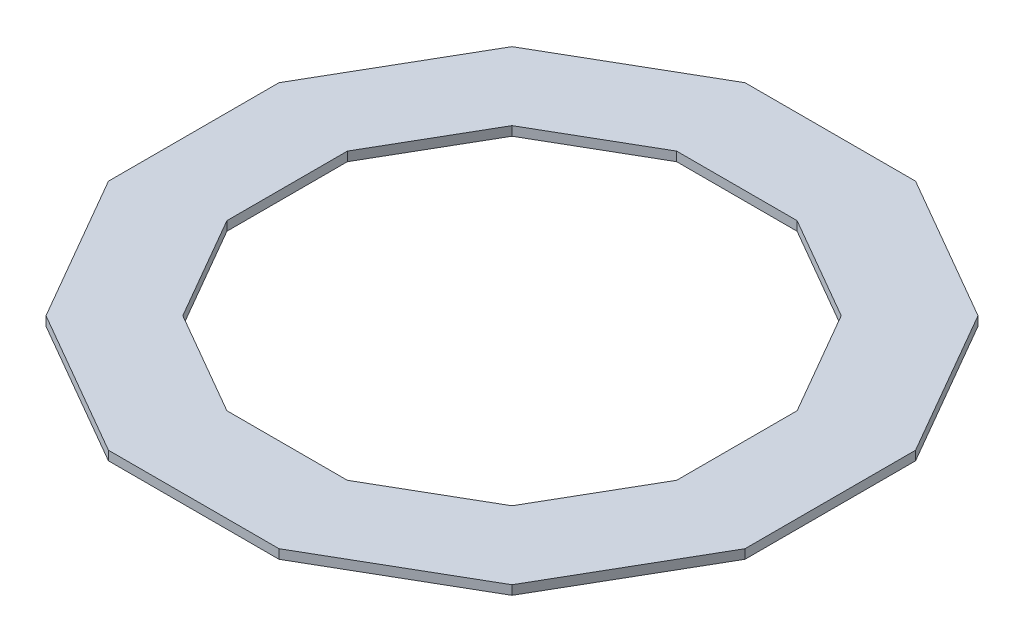
ISO-10303-21;
HEADER;
FILE_DESCRIPTION(('STEP AP214'),'2;1');
FILE_NAME('part.step','',(''),(''),'','','');
FILE_SCHEMA(('AUTOMOTIVE_DESIGN { 1 0 10303 214 1 1 1 1 }'));
ENDSEC;
DATA;
#1=APPLICATION_CONTEXT('core data for automotive mechanical design processes');
#2=APPLICATION_PROTOCOL_DEFINITION('international standard','automotive_design',2000,#1);
#3=PRODUCT_CONTEXT('',#1,'mechanical');
#4=PRODUCT('Part','Part','',(#3));
#5=PRODUCT_RELATED_PRODUCT_CATEGORY('part','',(#4));
#6=PRODUCT_DEFINITION_FORMATION('','',#4);
#7=PRODUCT_DEFINITION_CONTEXT('part definition',#1,'design');
#8=PRODUCT_DEFINITION('design','',#6,#7);
#9=PRODUCT_DEFINITION_SHAPE('','',#8);
#10=(LENGTH_UNIT() NAMED_UNIT(*) SI_UNIT(.MILLI.,.METRE.));
#11=(NAMED_UNIT(*) PLANE_ANGLE_UNIT() SI_UNIT($,.RADIAN.));
#12=(NAMED_UNIT(*) SI_UNIT($,.STERADIAN.) SOLID_ANGLE_UNIT());
#13=UNCERTAINTY_MEASURE_WITH_UNIT(LENGTH_MEASURE(1.E-05),#10,'distance_accuracy_value','');
#14=(GEOMETRIC_REPRESENTATION_CONTEXT(3) GLOBAL_UNCERTAINTY_ASSIGNED_CONTEXT((#13)) GLOBAL_UNIT_ASSIGNED_CONTEXT((#10,
#11,#12)) REPRESENTATION_CONTEXT('',''));
#15=CARTESIAN_POINT('',(0.,0.,0.));
#16=DIRECTION('',(0.,0.,1.));
#17=DIRECTION('',(1.,0.,0.));
#18=AXIS2_PLACEMENT_3D('',#15,#16,#17);
#19=CARTESIAN_POINT('',(0.,-2.921,0.));
#20=DIRECTION('',(0.,1.,0.));
#21=DIRECTION('',(0.,0.,1.));
#22=AXIS2_PLACEMENT_3D('',#19,#20,#21);
#23=PLANE('',#22);
#24=DIRECTION('',(0.5,0.,-0.866025403784439));
#25=VECTOR('',#24,1.);
#26=CARTESIAN_POINT('',(-61.8302660744763,-2.921,-35.6977207621651));
#27=LINE('',#26,#25);
#28=CARTESIAN_POINT('',(-71.3954415243302,-2.921,-19.1303508997077));
#29=VERTEX_POINT('',#28);
#30=CARTESIAN_POINT('',(-52.2650906246225,-2.921,-52.2650906246225));
#31=VERTEX_POINT('',#30);
#32=EDGE_CURVE('E278',#29,#31,#27,.T.);
#33=ORIENTED_EDGE('',*,*,#32,.F.);
#34=DIRECTION('',(0.,0.,-1.));
#35=VECTOR('',#34,1.);
#36=CARTESIAN_POINT('',(-71.3954415243302,-2.921,0.));
#37=LINE('',#36,#35);
#38=CARTESIAN_POINT('',(-71.3954415243302,-2.921,19.1303508997077));
#39=VERTEX_POINT('',#38);
#40=EDGE_CURVE('E280',#39,#29,#37,.T.);
#41=ORIENTED_EDGE('',*,*,#40,.F.);
#42=DIRECTION('',(-0.5,0.,-0.866025403784439));
#43=VECTOR('',#42,1.);
#44=CARTESIAN_POINT('',(-61.8302660744764,-2.921,35.6977207621651));
#45=LINE('',#44,#43);
#46=CARTESIAN_POINT('',(-52.2650906246225,-2.921,52.2650906246225));
#47=VERTEX_POINT('',#46);
#48=EDGE_CURVE('E283',#47,#39,#45,.T.);
#49=ORIENTED_EDGE('',*,*,#48,.F.);
#50=DIRECTION('',(-0.866025403784439,0.,-0.5));
#51=VECTOR('',#50,1.);
#52=CARTESIAN_POINT('',(-35.6977207621651,-2.921,61.8302660744764));
#53=LINE('',#52,#51);
#54=CARTESIAN_POINT('',(-19.1303508997077,-2.921,71.3954415243302));
#55=VERTEX_POINT('',#54);
#56=EDGE_CURVE('E285',#55,#47,#53,.T.);
#57=ORIENTED_EDGE('',*,*,#56,.F.);
#58=DIRECTION('',(-1.,0.,0.));
#59=VECTOR('',#58,1.);
#60=CARTESIAN_POINT('',(0.,-2.921,71.3954415243302));
#61=LINE('',#60,#59);
#62=CARTESIAN_POINT('',(19.1303508997077,-2.921,71.3954415243302));
#63=VERTEX_POINT('',#62);
#64=EDGE_CURVE('E287',#63,#55,#61,.T.);
#65=ORIENTED_EDGE('',*,*,#64,.F.);
#66=DIRECTION('',(-0.866025403784439,0.,0.5));
#67=VECTOR('',#66,1.);
#68=CARTESIAN_POINT('',(35.6977207621651,-2.921,61.8302660744764));
#69=LINE('',#68,#67);
#70=CARTESIAN_POINT('',(52.2650906246225,-2.921,52.2650906246225));
#71=VERTEX_POINT('',#70);
#72=EDGE_CURVE('E289',#71,#63,#69,.T.);
#73=ORIENTED_EDGE('',*,*,#72,.F.);
#74=DIRECTION('',(-0.5,0.,0.866025403784439));
#75=VECTOR('',#74,1.);
#76=CARTESIAN_POINT('',(61.8302660744764,-2.921,35.6977207621651));
#77=LINE('',#76,#75);
#78=CARTESIAN_POINT('',(71.3954415243302,-2.921,19.1303508997077));
#79=VERTEX_POINT('',#78);
#80=EDGE_CURVE('E291',#79,#71,#77,.T.);
#81=ORIENTED_EDGE('',*,*,#80,.F.);
#82=DIRECTION('',(0.,0.,1.));
#83=VECTOR('',#82,1.);
#84=CARTESIAN_POINT('',(71.3954415243302,-2.921,0.));
#85=LINE('',#84,#83);
#86=CARTESIAN_POINT('',(71.3954415243302,-2.921,-19.1303508997077));
#87=VERTEX_POINT('',#86);
#88=EDGE_CURVE('E293',#87,#79,#85,.T.);
#89=ORIENTED_EDGE('',*,*,#88,.F.);
#90=DIRECTION('',(0.5,0.,0.866025403784439));
#91=VECTOR('',#90,1.);
#92=CARTESIAN_POINT('',(61.8302660744763,-2.921,-35.6977207621651));
#93=LINE('',#92,#91);
#94=CARTESIAN_POINT('',(52.2650906246225,-2.921,-52.2650906246225));
#95=VERTEX_POINT('',#94);
#96=EDGE_CURVE('E295',#95,#87,#93,.T.);
#97=ORIENTED_EDGE('',*,*,#96,.F.);
#98=DIRECTION('',(0.866025403784439,0.,0.5));
#99=VECTOR('',#98,1.);
#100=CARTESIAN_POINT('',(35.6977207621651,-2.921,-61.8302660744763));
#101=LINE('',#100,#99);
#102=CARTESIAN_POINT('',(19.1303508997077,-2.921,-71.3954415243302));
#103=VERTEX_POINT('',#102);
#104=EDGE_CURVE('E297',#103,#95,#101,.T.);
#105=ORIENTED_EDGE('',*,*,#104,.F.);
#106=DIRECTION('',(1.,0.,0.));
#107=VECTOR('',#106,1.);
#108=CARTESIAN_POINT('',(0.,-2.921,-71.3954415243302));
#109=LINE('',#108,#107);
#110=CARTESIAN_POINT('',(-19.1303508997077,-2.921,-71.3954415243302));
#111=VERTEX_POINT('',#110);
#112=EDGE_CURVE('E299',#111,#103,#109,.T.);
#113=ORIENTED_EDGE('',*,*,#112,.F.);
#114=DIRECTION('',(0.866025403784439,0.,-0.5));
#115=VECTOR('',#114,1.);
#116=CARTESIAN_POINT('',(-35.6977207621651,-2.921,-61.8302660744763));
#117=LINE('',#116,#115);
#118=EDGE_CURVE('E301',#31,#111,#117,.T.);
#119=ORIENTED_EDGE('',*,*,#118,.F.);
#120=EDGE_LOOP('',(#33,#41,#49,#57,#65,#73,#81,#89,#97,#105,#113,#119));
#121=FACE_BOUND('',#120,.T.);
#122=DIRECTION('',(0.,0.,1.));
#123=VECTOR('',#122,1.);
#124=CARTESIAN_POINT('',(101.059063950969,-2.92100000000001,27.0786945735074));
#125=LINE('',#124,#123);
#126=CARTESIAN_POINT('',(101.059063950969,-2.92100000000001,-27.0786945735074));
#127=VERTEX_POINT('',#126);
#128=CARTESIAN_POINT('',(101.059063950969,-2.92100000000001,27.0786945735074));
#129=VERTEX_POINT('',#128);
#130=EDGE_CURVE('E210',#127,#129,#125,.T.);
#131=ORIENTED_EDGE('',*,*,#130,.T.);
#132=DIRECTION('',(-0.5,0.,0.866025403784439));
#133=VECTOR('',#132,1.);
#134=CARTESIAN_POINT('',(73.9803693774619,-2.92100000000001,73.9803693774619));
#135=LINE('',#134,#133);
#136=CARTESIAN_POINT('',(73.9803693774619,-2.92100000000001,73.9803693774619));
#137=VERTEX_POINT('',#136);
#138=EDGE_CURVE('E597',#129,#137,#135,.T.);
#139=ORIENTED_EDGE('',*,*,#138,.T.);
#140=DIRECTION('',(-0.866025403784439,0.,0.5));
#141=VECTOR('',#140,1.);
#142=CARTESIAN_POINT('',(27.0786945735074,-2.92100000000001,101.059063950969));
#143=LINE('',#142,#141);
#144=CARTESIAN_POINT('',(27.0786945735074,-2.92100000000001,101.059063950969));
#145=VERTEX_POINT('',#144);
#146=EDGE_CURVE('E599',#137,#145,#143,.T.);
#147=ORIENTED_EDGE('',*,*,#146,.T.);
#148=DIRECTION('',(-1.,0.,0.));
#149=VECTOR('',#148,1.);
#150=CARTESIAN_POINT('',(-27.0786945735074,-2.92100000000001,101.059063950969));
#151=LINE('',#150,#149);
#152=CARTESIAN_POINT('',(-27.0786945735074,-2.92100000000001,101.059063950969));
#153=VERTEX_POINT('',#152);
#154=EDGE_CURVE('E600',#145,#153,#151,.T.);
#155=ORIENTED_EDGE('',*,*,#154,.T.);
#156=DIRECTION('',(-0.866025403784439,0.,-0.5));
#157=VECTOR('',#156,1.);
#158=CARTESIAN_POINT('',(-73.9803693774619,-2.92100000000001,73.9803693774619));
#159=LINE('',#158,#157);
#160=CARTESIAN_POINT('',(-73.9803693774619,-2.92100000000001,73.9803693774619));
#161=VERTEX_POINT('',#160);
#162=EDGE_CURVE('E604',#153,#161,#159,.T.);
#163=ORIENTED_EDGE('',*,*,#162,.T.);
#164=DIRECTION('',(-0.5,0.,-0.866025403784438));
#165=VECTOR('',#164,1.);
#166=CARTESIAN_POINT('',(-101.059063950969,-2.92100000000001,27.0786945735074));
#167=LINE('',#166,#165);
#168=CARTESIAN_POINT('',(-101.059063950969,-2.92100000000001,27.0786945735074));
#169=VERTEX_POINT('',#168);
#170=EDGE_CURVE('E606',#161,#169,#167,.T.);
#171=ORIENTED_EDGE('',*,*,#170,.T.);
#172=DIRECTION('',(0.,0.,-1.));
#173=VECTOR('',#172,1.);
#174=CARTESIAN_POINT('',(-101.059063950969,-2.92100000000001,-27.0786945735074));
#175=LINE('',#174,#173);
#176=CARTESIAN_POINT('',(-101.059063950969,-2.92100000000001,-27.0786945735074));
#177=VERTEX_POINT('',#176);
#178=EDGE_CURVE('E608',#169,#177,#175,.T.);
#179=ORIENTED_EDGE('',*,*,#178,.T.);
#180=DIRECTION('',(0.500000000000001,0.,-0.866025403784438));
#181=VECTOR('',#180,1.);
#182=CARTESIAN_POINT('',(-73.9803693774619,-2.92100000000001,-73.9803693774619));
#183=LINE('',#182,#181);
#184=CARTESIAN_POINT('',(-73.9803693774619,-2.92100000000001,-73.9803693774619));
#185=VERTEX_POINT('',#184);
#186=EDGE_CURVE('E610',#177,#185,#183,.T.);
#187=ORIENTED_EDGE('',*,*,#186,.T.);
#188=DIRECTION('',(0.866025403784438,0.,-0.5));
#189=VECTOR('',#188,1.);
#190=CARTESIAN_POINT('',(-27.0786945735074,-2.92100000000001,-101.059063950969));
#191=LINE('',#190,#189);
#192=CARTESIAN_POINT('',(-27.0786945735074,-2.92100000000001,-101.059063950969));
#193=VERTEX_POINT('',#192);
#194=EDGE_CURVE('E612',#185,#193,#191,.T.);
#195=ORIENTED_EDGE('',*,*,#194,.T.);
#196=DIRECTION('',(1.,0.,0.));
#197=VECTOR('',#196,1.);
#198=CARTESIAN_POINT('',(27.0786945735074,-2.92100000000001,-101.059063950969));
#199=LINE('',#198,#197);
#200=CARTESIAN_POINT('',(27.0786945735074,-2.92100000000001,-101.059063950969));
#201=VERTEX_POINT('',#200);
#202=EDGE_CURVE('E614',#193,#201,#199,.T.);
#203=ORIENTED_EDGE('',*,*,#202,.T.);
#204=DIRECTION('',(0.866025403784438,0.,0.5));
#205=VECTOR('',#204,1.);
#206=CARTESIAN_POINT('',(73.9803693774619,-2.92100000000001,-73.9803693774619));
#207=LINE('',#206,#205);
#208=CARTESIAN_POINT('',(73.9803693774619,-2.92100000000001,-73.9803693774619));
#209=VERTEX_POINT('',#208);
#210=EDGE_CURVE('E258',#201,#209,#207,.T.);
#211=ORIENTED_EDGE('',*,*,#210,.T.);
#212=DIRECTION('',(0.5,0.,0.866025403784438));
#213=VECTOR('',#212,1.);
#214=CARTESIAN_POINT('',(101.059063950969,-2.92100000000001,-27.0786945735074));
#215=LINE('',#214,#213);
#216=EDGE_CURVE('E305',#209,#127,#215,.T.);
#217=ORIENTED_EDGE('',*,*,#216,.T.);
#218=EDGE_LOOP('',(#131,#139,#147,#155,#163,#171,#179,#187,#195,#203,#211,#217));
#219=FACE_BOUND('',#218,.T.);
#220=ADVANCED_FACE('F38',(#121,#219),#23,.F.);
#221=CARTESIAN_POINT('',(0.,0.,0.));
#222=DIRECTION('',(0.,1.,0.));
#223=DIRECTION('',(0.,0.,1.));
#224=AXIS2_PLACEMENT_3D('',#221,#222,#223);
#225=PLANE('',#224);
#226=DIRECTION('',(0.,0.,-1.));
#227=VECTOR('',#226,1.);
#228=CARTESIAN_POINT('',(-71.3954415243302,0.,0.));
#229=LINE('',#228,#227);
#230=CARTESIAN_POINT('',(-71.3954415243302,0.,19.1303508997077));
#231=VERTEX_POINT('',#230);
#232=CARTESIAN_POINT('',(-71.3954415243302,0.,-19.1303508997077));
#233=VERTEX_POINT('',#232);
#234=EDGE_CURVE('E304',#231,#233,#229,.T.);
#235=ORIENTED_EDGE('',*,*,#234,.T.);
#236=DIRECTION('',(0.5,0.,-0.866025403784439));
#237=VECTOR('',#236,1.);
#238=CARTESIAN_POINT('',(-61.8302660744763,0.,-35.6977207621651));
#239=LINE('',#238,#237);
#240=CARTESIAN_POINT('',(-52.2650906246225,0.,-52.2650906246225));
#241=VERTEX_POINT('',#240);
#242=EDGE_CURVE('E62',#233,#241,#239,.T.);
#243=ORIENTED_EDGE('',*,*,#242,.T.);
#244=DIRECTION('',(0.866025403784439,0.,-0.5));
#245=VECTOR('',#244,1.);
#246=CARTESIAN_POINT('',(-35.6977207621651,0.,-61.8302660744763));
#247=LINE('',#246,#245);
#248=CARTESIAN_POINT('',(-19.1303508997077,0.,-71.3954415243302));
#249=VERTEX_POINT('',#248);
#250=EDGE_CURVE('E281',#241,#249,#247,.T.);
#251=ORIENTED_EDGE('',*,*,#250,.T.);
#252=DIRECTION('',(1.,0.,0.));
#253=VECTOR('',#252,1.);
#254=CARTESIAN_POINT('',(0.,0.,-71.3954415243302));
#255=LINE('',#254,#253);
#256=CARTESIAN_POINT('',(19.1303508997077,0.,-71.3954415243302));
#257=VERTEX_POINT('',#256);
#258=EDGE_CURVE('E332',#249,#257,#255,.T.);
#259=ORIENTED_EDGE('',*,*,#258,.T.);
#260=DIRECTION('',(0.866025403784439,0.,0.5));
#261=VECTOR('',#260,1.);
#262=CARTESIAN_POINT('',(35.6977207621651,0.,-61.8302660744763));
#263=LINE('',#262,#261);
#264=CARTESIAN_POINT('',(52.2650906246225,0.,-52.2650906246225));
#265=VERTEX_POINT('',#264);
#266=EDGE_CURVE('E329',#257,#265,#263,.T.);
#267=ORIENTED_EDGE('',*,*,#266,.T.);
#268=DIRECTION('',(0.5,0.,0.866025403784439));
#269=VECTOR('',#268,1.);
#270=CARTESIAN_POINT('',(61.8302660744763,0.,-35.6977207621651));
#271=LINE('',#270,#269);
#272=CARTESIAN_POINT('',(71.3954415243302,0.,-19.1303508997077));
#273=VERTEX_POINT('',#272);
#274=EDGE_CURVE('E326',#265,#273,#271,.T.);
#275=ORIENTED_EDGE('',*,*,#274,.T.);
#276=DIRECTION('',(0.,0.,1.));
#277=VECTOR('',#276,1.);
#278=CARTESIAN_POINT('',(71.3954415243302,0.,0.));
#279=LINE('',#278,#277);
#280=CARTESIAN_POINT('',(71.3954415243302,0.,19.1303508997077));
#281=VERTEX_POINT('',#280);
#282=EDGE_CURVE('E323',#273,#281,#279,.T.);
#283=ORIENTED_EDGE('',*,*,#282,.T.);
#284=DIRECTION('',(-0.5,0.,0.866025403784439));
#285=VECTOR('',#284,1.);
#286=CARTESIAN_POINT('',(61.8302660744764,0.,35.6977207621651));
#287=LINE('',#286,#285);
#288=CARTESIAN_POINT('',(52.2650906246225,0.,52.2650906246225));
#289=VERTEX_POINT('',#288);
#290=EDGE_CURVE('E320',#281,#289,#287,.T.);
#291=ORIENTED_EDGE('',*,*,#290,.T.);
#292=DIRECTION('',(-0.866025403784439,0.,0.5));
#293=VECTOR('',#292,1.);
#294=CARTESIAN_POINT('',(35.6977207621651,0.,61.8302660744764));
#295=LINE('',#294,#293);
#296=CARTESIAN_POINT('',(19.1303508997077,0.,71.3954415243302));
#297=VERTEX_POINT('',#296);
#298=EDGE_CURVE('E317',#289,#297,#295,.T.);
#299=ORIENTED_EDGE('',*,*,#298,.T.);
#300=DIRECTION('',(-1.,0.,0.));
#301=VECTOR('',#300,1.);
#302=CARTESIAN_POINT('',(0.,0.,71.3954415243302));
#303=LINE('',#302,#301);
#304=CARTESIAN_POINT('',(-19.1303508997077,0.,71.3954415243302));
#305=VERTEX_POINT('',#304);
#306=EDGE_CURVE('E314',#297,#305,#303,.T.);
#307=ORIENTED_EDGE('',*,*,#306,.T.);
#308=DIRECTION('',(-0.866025403784439,0.,-0.5));
#309=VECTOR('',#308,1.);
#310=CARTESIAN_POINT('',(-35.6977207621651,0.,61.8302660744764));
#311=LINE('',#310,#309);
#312=CARTESIAN_POINT('',(-52.2650906246225,0.,52.2650906246225));
#313=VERTEX_POINT('',#312);
#314=EDGE_CURVE('E311',#305,#313,#311,.T.);
#315=ORIENTED_EDGE('',*,*,#314,.T.);
#316=DIRECTION('',(-0.5,0.,-0.866025403784439));
#317=VECTOR('',#316,1.);
#318=CARTESIAN_POINT('',(-61.8302660744764,0.,35.6977207621651));
#319=LINE('',#318,#317);
#320=EDGE_CURVE('E308',#313,#231,#319,.T.);
#321=ORIENTED_EDGE('',*,*,#320,.T.);
#322=EDGE_LOOP('',(#235,#243,#251,#259,#267,#275,#283,#291,#299,#307,#315,#321));
#323=FACE_BOUND('',#322,.T.);
#324=DIRECTION('',(0.,0.,-1.));
#325=VECTOR('',#324,1.);
#326=CARTESIAN_POINT('',(101.059063950969,0.,27.0786945735074));
#327=LINE('',#326,#325);
#328=CARTESIAN_POINT('',(101.059063950969,0.,27.0786945735074));
#329=VERTEX_POINT('',#328);
#330=CARTESIAN_POINT('',(101.059063950969,0.,-27.0786945735074));
#331=VERTEX_POINT('',#330);
#332=EDGE_CURVE('E208',#329,#331,#327,.T.);
#333=ORIENTED_EDGE('',*,*,#332,.T.);
#334=DIRECTION('',(-0.5,0.,-0.866025403784438));
#335=VECTOR('',#334,1.);
#336=CARTESIAN_POINT('',(101.059063950969,0.,-27.0786945735074));
#337=LINE('',#336,#335);
#338=CARTESIAN_POINT('',(73.9803693774619,0.,-73.9803693774619));
#339=VERTEX_POINT('',#338);
#340=EDGE_CURVE('E217',#331,#339,#337,.T.);
#341=ORIENTED_EDGE('',*,*,#340,.T.);
#342=DIRECTION('',(-0.866025403784438,0.,-0.5));
#343=VECTOR('',#342,1.);
#344=CARTESIAN_POINT('',(73.9803693774619,0.,-73.9803693774619));
#345=LINE('',#344,#343);
#346=CARTESIAN_POINT('',(27.0786945735074,0.,-101.059063950969));
#347=VERTEX_POINT('',#346);
#348=EDGE_CURVE('E223',#339,#347,#345,.T.);
#349=ORIENTED_EDGE('',*,*,#348,.T.);
#350=DIRECTION('',(-1.,0.,0.));
#351=VECTOR('',#350,1.);
#352=CARTESIAN_POINT('',(27.0786945735074,0.,-101.059063950969));
#353=LINE('',#352,#351);
#354=CARTESIAN_POINT('',(-27.0786945735074,0.,-101.059063950969));
#355=VERTEX_POINT('',#354);
#356=EDGE_CURVE('E232',#347,#355,#353,.T.);
#357=ORIENTED_EDGE('',*,*,#356,.T.);
#358=DIRECTION('',(-0.866025403784438,0.,0.5));
#359=VECTOR('',#358,1.);
#360=CARTESIAN_POINT('',(-27.0786945735074,0.,-101.059063950969));
#361=LINE('',#360,#359);
#362=CARTESIAN_POINT('',(-73.9803693774619,0.,-73.9803693774619));
#363=VERTEX_POINT('',#362);
#364=EDGE_CURVE('E235',#355,#363,#361,.T.);
#365=ORIENTED_EDGE('',*,*,#364,.T.);
#366=DIRECTION('',(-0.500000000000001,0.,0.866025403784438));
#367=VECTOR('',#366,1.);
#368=CARTESIAN_POINT('',(-73.9803693774619,0.,-73.9803693774619));
#369=LINE('',#368,#367);
#370=CARTESIAN_POINT('',(-101.059063950969,0.,-27.0786945735074));
#371=VERTEX_POINT('',#370);
#372=EDGE_CURVE('E238',#363,#371,#369,.T.);
#373=ORIENTED_EDGE('',*,*,#372,.T.);
#374=DIRECTION('',(0.,0.,1.));
#375=VECTOR('',#374,1.);
#376=CARTESIAN_POINT('',(-101.059063950969,0.,-27.0786945735074));
#377=LINE('',#376,#375);
#378=CARTESIAN_POINT('',(-101.059063950969,0.,27.0786945735074));
#379=VERTEX_POINT('',#378);
#380=EDGE_CURVE('E241',#371,#379,#377,.T.);
#381=ORIENTED_EDGE('',*,*,#380,.T.);
#382=DIRECTION('',(0.5,0.,0.866025403784438));
#383=VECTOR('',#382,1.);
#384=CARTESIAN_POINT('',(-101.059063950969,0.,27.0786945735074));
#385=LINE('',#384,#383);
#386=CARTESIAN_POINT('',(-73.9803693774619,0.,73.9803693774619));
#387=VERTEX_POINT('',#386);
#388=EDGE_CURVE('E244',#379,#387,#385,.T.);
#389=ORIENTED_EDGE('',*,*,#388,.T.);
#390=DIRECTION('',(0.866025403784438,0.,0.5));
#391=VECTOR('',#390,1.);
#392=CARTESIAN_POINT('',(-73.9803693774619,0.,73.9803693774619));
#393=LINE('',#392,#391);
#394=CARTESIAN_POINT('',(-27.0786945735074,0.,101.059063950969));
#395=VERTEX_POINT('',#394);
#396=EDGE_CURVE('E247',#387,#395,#393,.T.);
#397=ORIENTED_EDGE('',*,*,#396,.T.);
#398=DIRECTION('',(1.,0.,0.));
#399=VECTOR('',#398,1.);
#400=CARTESIAN_POINT('',(-27.0786945735074,0.,101.059063950969));
#401=LINE('',#400,#399);
#402=CARTESIAN_POINT('',(27.0786945735074,0.,101.059063950969));
#403=VERTEX_POINT('',#402);
#404=EDGE_CURVE('E250',#395,#403,#401,.T.);
#405=ORIENTED_EDGE('',*,*,#404,.T.);
#406=DIRECTION('',(0.866025403784439,0.,-0.5));
#407=VECTOR('',#406,1.);
#408=CARTESIAN_POINT('',(27.0786945735074,0.,101.059063950969));
#409=LINE('',#408,#407);
#410=CARTESIAN_POINT('',(73.9803693774619,0.,73.9803693774619));
#411=VERTEX_POINT('',#410);
#412=EDGE_CURVE('E253',#403,#411,#409,.T.);
#413=ORIENTED_EDGE('',*,*,#412,.T.);
#414=DIRECTION('',(0.5,0.,-0.866025403784439));
#415=VECTOR('',#414,1.);
#416=CARTESIAN_POINT('',(73.9803693774619,0.,73.9803693774619));
#417=LINE('',#416,#415);
#418=EDGE_CURVE('E214',#411,#329,#417,.T.);
#419=ORIENTED_EDGE('',*,*,#418,.T.);
#420=EDGE_LOOP('',(#333,#341,#349,#357,#365,#373,#381,#389,#397,#405,#413,#419));
#421=FACE_BOUND('',#420,.T.);
#422=ADVANCED_FACE('F40',(#323,#421),#225,.T.);
#423=CARTESIAN_POINT('',(-61.8302660744763,-2.921,-35.6977207621651));
#424=DIRECTION('',(0.866025403784439,0.,0.5));
#425=DIRECTION('',(0.5,0.,-0.866025403784439));
#426=AXIS2_PLACEMENT_3D('',#423,#424,#425);
#427=PLANE('',#426);
#428=ORIENTED_EDGE('',*,*,#242,.F.);
#429=DIRECTION('',(0.,1.,0.));
#430=VECTOR('',#429,1.);
#431=CARTESIAN_POINT('',(-71.3954415243302,-2.921,-19.1303508997077));
#432=LINE('',#431,#430);
#433=EDGE_CURVE('E42',#29,#233,#432,.T.);
#434=ORIENTED_EDGE('',*,*,#433,.F.);
#435=ORIENTED_EDGE('',*,*,#32,.T.);
#436=DIRECTION('',(0.,1.,0.));
#437=VECTOR('',#436,1.);
#438=CARTESIAN_POINT('',(-52.2650906246225,-2.921,-52.2650906246225));
#439=LINE('',#438,#437);
#440=EDGE_CURVE('E11',#31,#241,#439,.T.);
#441=ORIENTED_EDGE('',*,*,#440,.T.);
#442=EDGE_LOOP('',(#428,#434,#435,#441));
#443=FACE_BOUND('',#442,.T.);
#444=ADVANCED_FACE('F371',(#443),#427,.T.);
#445=CARTESIAN_POINT('',(-35.6977207621651,-2.921,-61.8302660744763));
#446=DIRECTION('',(0.5,0.,0.866025403784439));
#447=DIRECTION('',(0.866025403784439,0.,-0.5));
#448=AXIS2_PLACEMENT_3D('',#445,#446,#447);
#449=PLANE('',#448);
#450=ORIENTED_EDGE('',*,*,#250,.F.);
#451=ORIENTED_EDGE('',*,*,#440,.F.);
#452=ORIENTED_EDGE('',*,*,#118,.T.);
#453=DIRECTION('',(0.,1.,0.));
#454=VECTOR('',#453,1.);
#455=CARTESIAN_POINT('',(-19.1303508997077,-2.921,-71.3954415243302));
#456=LINE('',#455,#454);
#457=EDGE_CURVE('E47',#111,#249,#456,.T.);
#458=ORIENTED_EDGE('',*,*,#457,.T.);
#459=EDGE_LOOP('',(#450,#451,#452,#458));
#460=FACE_BOUND('',#459,.T.);
#461=ADVANCED_FACE('F373',(#460),#449,.T.);
#462=CARTESIAN_POINT('',(0.,-2.921,-71.3954415243302));
#463=DIRECTION('',(0.,0.,1.));
#464=DIRECTION('',(1.,0.,0.));
#465=AXIS2_PLACEMENT_3D('',#462,#463,#464);
#466=PLANE('',#465);
#467=ORIENTED_EDGE('',*,*,#258,.F.);
#468=ORIENTED_EDGE('',*,*,#457,.F.);
#469=ORIENTED_EDGE('',*,*,#112,.T.);
#470=DIRECTION('',(0.,1.,0.));
#471=VECTOR('',#470,1.);
#472=CARTESIAN_POINT('',(19.1303508997077,-2.921,-71.3954415243302));
#473=LINE('',#472,#471);
#474=EDGE_CURVE('E338',#103,#257,#473,.T.);
#475=ORIENTED_EDGE('',*,*,#474,.T.);
#476=EDGE_LOOP('',(#467,#468,#469,#475));
#477=FACE_BOUND('',#476,.T.);
#478=ADVANCED_FACE('F378',(#477),#466,.T.);
#479=CARTESIAN_POINT('',(35.6977207621651,-2.921,-61.8302660744763));
#480=DIRECTION('',(-0.5,0.,0.866025403784439));
#481=DIRECTION('',(0.866025403784439,0.,0.5));
#482=AXIS2_PLACEMENT_3D('',#479,#480,#481);
#483=PLANE('',#482);
#484=ORIENTED_EDGE('',*,*,#266,.F.);
#485=ORIENTED_EDGE('',*,*,#474,.F.);
#486=ORIENTED_EDGE('',*,*,#104,.T.);
#487=DIRECTION('',(0.,1.,0.));
#488=VECTOR('',#487,1.);
#489=CARTESIAN_POINT('',(52.2650906246225,-2.921,-52.2650906246225));
#490=LINE('',#489,#488);
#491=EDGE_CURVE('E340',#95,#265,#490,.T.);
#492=ORIENTED_EDGE('',*,*,#491,.T.);
#493=EDGE_LOOP('',(#484,#485,#486,#492));
#494=FACE_BOUND('',#493,.T.);
#495=ADVANCED_FACE('F382',(#494),#483,.T.);
#496=CARTESIAN_POINT('',(61.8302660744763,-2.921,-35.6977207621651));
#497=DIRECTION('',(-0.866025403784439,0.,0.5));
#498=DIRECTION('',(0.5,0.,0.866025403784438));
#499=AXIS2_PLACEMENT_3D('',#496,#497,#498);
#500=PLANE('',#499);
#501=ORIENTED_EDGE('',*,*,#274,.F.);
#502=ORIENTED_EDGE('',*,*,#491,.F.);
#503=ORIENTED_EDGE('',*,*,#96,.T.);
#504=DIRECTION('',(0.,1.,0.));
#505=VECTOR('',#504,1.);
#506=CARTESIAN_POINT('',(71.3954415243302,-2.921,-19.1303508997077));
#507=LINE('',#506,#505);
#508=EDGE_CURVE('E342',#87,#273,#507,.T.);
#509=ORIENTED_EDGE('',*,*,#508,.T.);
#510=EDGE_LOOP('',(#501,#502,#503,#509));
#511=FACE_BOUND('',#510,.T.);
#512=ADVANCED_FACE('F387',(#511),#500,.T.);
#513=CARTESIAN_POINT('',(71.3954415243302,-2.921,0.));
#514=DIRECTION('',(-1.,0.,0.));
#515=DIRECTION('',(0.,0.,1.));
#516=AXIS2_PLACEMENT_3D('',#513,#514,#515);
#517=PLANE('',#516);
#518=ORIENTED_EDGE('',*,*,#282,.F.);
#519=ORIENTED_EDGE('',*,*,#508,.F.);
#520=ORIENTED_EDGE('',*,*,#88,.T.);
#521=DIRECTION('',(0.,1.,0.));
#522=VECTOR('',#521,1.);
#523=CARTESIAN_POINT('',(71.3954415243302,-2.921,19.1303508997077));
#524=LINE('',#523,#522);
#525=EDGE_CURVE('E344',#79,#281,#524,.T.);
#526=ORIENTED_EDGE('',*,*,#525,.T.);
#527=EDGE_LOOP('',(#518,#519,#520,#526));
#528=FACE_BOUND('',#527,.T.);
#529=ADVANCED_FACE('F392',(#528),#517,.T.);
#530=CARTESIAN_POINT('',(61.8302660744764,-2.921,35.6977207621651));
#531=DIRECTION('',(-0.866025403784439,0.,-0.5));
#532=DIRECTION('',(-0.5,0.,0.866025403784438));
#533=AXIS2_PLACEMENT_3D('',#530,#531,#532);
#534=PLANE('',#533);
#535=ORIENTED_EDGE('',*,*,#290,.F.);
#536=ORIENTED_EDGE('',*,*,#525,.F.);
#537=ORIENTED_EDGE('',*,*,#80,.T.);
#538=DIRECTION('',(0.,1.,0.));
#539=VECTOR('',#538,1.);
#540=CARTESIAN_POINT('',(52.2650906246225,-2.921,52.2650906246225));
#541=LINE('',#540,#539);
#542=EDGE_CURVE('E346',#71,#289,#541,.T.);
#543=ORIENTED_EDGE('',*,*,#542,.T.);
#544=EDGE_LOOP('',(#535,#536,#537,#543));
#545=FACE_BOUND('',#544,.T.);
#546=ADVANCED_FACE('F397',(#545),#534,.T.);
#547=CARTESIAN_POINT('',(35.6977207621651,-2.921,61.8302660744764));
#548=DIRECTION('',(-0.5,0.,-0.866025403784439));
#549=DIRECTION('',(-0.866025403784439,0.,0.5));
#550=AXIS2_PLACEMENT_3D('',#547,#548,#549);
#551=PLANE('',#550);
#552=ORIENTED_EDGE('',*,*,#298,.F.);
#553=ORIENTED_EDGE('',*,*,#542,.F.);
#554=ORIENTED_EDGE('',*,*,#72,.T.);
#555=DIRECTION('',(0.,1.,0.));
#556=VECTOR('',#555,1.);
#557=CARTESIAN_POINT('',(19.1303508997077,-2.921,71.3954415243302));
#558=LINE('',#557,#556);
#559=EDGE_CURVE('E348',#63,#297,#558,.T.);
#560=ORIENTED_EDGE('',*,*,#559,.T.);
#561=EDGE_LOOP('',(#552,#553,#554,#560));
#562=FACE_BOUND('',#561,.T.);
#563=ADVANCED_FACE('F402',(#562),#551,.T.);
#564=CARTESIAN_POINT('',(0.,-2.921,71.3954415243302));
#565=DIRECTION('',(0.,0.,-1.));
#566=DIRECTION('',(-1.,0.,0.));
#567=AXIS2_PLACEMENT_3D('',#564,#565,#566);
#568=PLANE('',#567);
#569=ORIENTED_EDGE('',*,*,#306,.F.);
#570=ORIENTED_EDGE('',*,*,#559,.F.);
#571=ORIENTED_EDGE('',*,*,#64,.T.);
#572=DIRECTION('',(0.,1.,0.));
#573=VECTOR('',#572,1.);
#574=CARTESIAN_POINT('',(-19.1303508997077,-2.921,71.3954415243302));
#575=LINE('',#574,#573);
#576=EDGE_CURVE('E350',#55,#305,#575,.T.);
#577=ORIENTED_EDGE('',*,*,#576,.T.);
#578=EDGE_LOOP('',(#569,#570,#571,#577));
#579=FACE_BOUND('',#578,.T.);
#580=ADVANCED_FACE('F406',(#579),#568,.T.);
#581=CARTESIAN_POINT('',(-35.6977207621651,-2.921,61.8302660744764));
#582=DIRECTION('',(0.5,0.,-0.866025403784439));
#583=DIRECTION('',(-0.866025403784439,0.,-0.5));
#584=AXIS2_PLACEMENT_3D('',#581,#582,#583);
#585=PLANE('',#584);
#586=ORIENTED_EDGE('',*,*,#314,.F.);
#587=ORIENTED_EDGE('',*,*,#576,.F.);
#588=ORIENTED_EDGE('',*,*,#56,.T.);
#589=DIRECTION('',(0.,1.,0.));
#590=VECTOR('',#589,1.);
#591=CARTESIAN_POINT('',(-52.2650906246225,-2.921,52.2650906246225));
#592=LINE('',#591,#590);
#593=EDGE_CURVE('E352',#47,#313,#592,.T.);
#594=ORIENTED_EDGE('',*,*,#593,.T.);
#595=EDGE_LOOP('',(#586,#587,#588,#594));
#596=FACE_BOUND('',#595,.T.);
#597=ADVANCED_FACE('F408',(#596),#585,.T.);
#598=CARTESIAN_POINT('',(-61.8302660744764,-2.921,35.6977207621651));
#599=DIRECTION('',(0.866025403784439,0.,-0.5));
#600=DIRECTION('',(-0.5,0.,-0.866025403784439));
#601=AXIS2_PLACEMENT_3D('',#598,#599,#600);
#602=PLANE('',#601);
#603=ORIENTED_EDGE('',*,*,#320,.F.);
#604=ORIENTED_EDGE('',*,*,#593,.F.);
#605=ORIENTED_EDGE('',*,*,#48,.T.);
#606=DIRECTION('',(0.,1.,0.));
#607=VECTOR('',#606,1.);
#608=CARTESIAN_POINT('',(-71.3954415243302,-2.921,19.1303508997077));
#609=LINE('',#608,#607);
#610=EDGE_CURVE('E55',#39,#231,#609,.T.);
#611=ORIENTED_EDGE('',*,*,#610,.T.);
#612=EDGE_LOOP('',(#603,#604,#605,#611));
#613=FACE_BOUND('',#612,.T.);
#614=ADVANCED_FACE('F361',(#613),#602,.T.);
#615=CARTESIAN_POINT('',(-71.3954415243302,-2.921,0.));
#616=DIRECTION('',(1.,0.,0.));
#617=DIRECTION('',(0.,0.,-1.));
#618=AXIS2_PLACEMENT_3D('',#615,#616,#617);
#619=PLANE('',#618);
#620=ORIENTED_EDGE('',*,*,#234,.F.);
#621=ORIENTED_EDGE('',*,*,#610,.F.);
#622=ORIENTED_EDGE('',*,*,#40,.T.);
#623=ORIENTED_EDGE('',*,*,#433,.T.);
#624=EDGE_LOOP('',(#620,#621,#622,#623));
#625=FACE_BOUND('',#624,.T.);
#626=ADVANCED_FACE('F355',(#625),#619,.T.);
#627=CARTESIAN_POINT('',(101.059063950969,-288.759197680382,-27.0786945735074));
#628=DIRECTION('',(0.866025403784438,0.,-0.5));
#629=DIRECTION('',(-0.5,0.,-0.866025403784438));
#630=AXIS2_PLACEMENT_3D('',#627,#628,#629);
#631=PLANE('',#630);
#632=ORIENTED_EDGE('',*,*,#216,.F.);
#633=DIRECTION('',(0.,1.,0.));
#634=VECTOR('',#633,1.);
#635=CARTESIAN_POINT('',(73.9803693774619,-288.759197680382,-73.9803693774619));
#636=LINE('',#635,#634);
#637=EDGE_CURVE('E213',#209,#339,#636,.T.);
#638=ORIENTED_EDGE('',*,*,#637,.T.);
#639=ORIENTED_EDGE('',*,*,#340,.F.);
#640=DIRECTION('',(0.,1.,0.));
#641=VECTOR('',#640,1.);
#642=CARTESIAN_POINT('',(101.059063950969,-288.759197680382,-27.0786945735074));
#643=LINE('',#642,#641);
#644=EDGE_CURVE('E203',#127,#331,#643,.T.);
#645=ORIENTED_EDGE('',*,*,#644,.F.);
#646=EDGE_LOOP('',(#632,#638,#639,#645));
#647=FACE_BOUND('',#646,.T.);
#648=ADVANCED_FACE('F218',(#647),#631,.T.);
#649=CARTESIAN_POINT('',(73.9803693774619,-288.759197680382,-73.9803693774619));
#650=DIRECTION('',(0.5,0.,-0.866025403784438));
#651=DIRECTION('',(-0.866025403784438,0.,-0.5));
#652=AXIS2_PLACEMENT_3D('',#649,#650,#651);
#653=PLANE('',#652);
#654=ORIENTED_EDGE('',*,*,#210,.F.);
#655=DIRECTION('',(0.,1.,0.));
#656=VECTOR('',#655,1.);
#657=CARTESIAN_POINT('',(27.0786945735074,-288.759197680382,-101.059063950969));
#658=LINE('',#657,#656);
#659=EDGE_CURVE('E275',#201,#347,#658,.T.);
#660=ORIENTED_EDGE('',*,*,#659,.T.);
#661=ORIENTED_EDGE('',*,*,#348,.F.);
#662=ORIENTED_EDGE('',*,*,#637,.F.);
#663=EDGE_LOOP('',(#654,#660,#661,#662));
#664=FACE_BOUND('',#663,.T.);
#665=ADVANCED_FACE('F428',(#664),#653,.T.);
#666=CARTESIAN_POINT('',(27.0786945735074,-288.759197680382,-101.059063950969));
#667=DIRECTION('',(0.,0.,-1.));
#668=DIRECTION('',(-1.,0.,0.));
#669=AXIS2_PLACEMENT_3D('',#666,#667,#668);
#670=PLANE('',#669);
#671=ORIENTED_EDGE('',*,*,#202,.F.);
#672=DIRECTION('',(0.,1.,0.));
#673=VECTOR('',#672,1.);
#674=CARTESIAN_POINT('',(-27.0786945735074,-288.759197680382,-101.059063950969));
#675=LINE('',#674,#673);
#676=EDGE_CURVE('E273',#193,#355,#675,.T.);
#677=ORIENTED_EDGE('',*,*,#676,.T.);
#678=ORIENTED_EDGE('',*,*,#356,.F.);
#679=ORIENTED_EDGE('',*,*,#659,.F.);
#680=EDGE_LOOP('',(#671,#677,#678,#679));
#681=FACE_BOUND('',#680,.T.);
#682=ADVANCED_FACE('F433',(#681),#670,.T.);
#683=CARTESIAN_POINT('',(-27.0786945735074,-288.759197680382,-101.059063950969));
#684=DIRECTION('',(-0.5,0.,-0.866025403784438));
#685=DIRECTION('',(-0.866025403784438,0.,0.5));
#686=AXIS2_PLACEMENT_3D('',#683,#684,#685);
#687=PLANE('',#686);
#688=ORIENTED_EDGE('',*,*,#194,.F.);
#689=DIRECTION('',(0.,1.,0.));
#690=VECTOR('',#689,1.);
#691=CARTESIAN_POINT('',(-73.9803693774619,-288.759197680382,-73.9803693774619));
#692=LINE('',#691,#690);
#693=EDGE_CURVE('E271',#185,#363,#692,.T.);
#694=ORIENTED_EDGE('',*,*,#693,.T.);
#695=ORIENTED_EDGE('',*,*,#364,.F.);
#696=ORIENTED_EDGE('',*,*,#676,.F.);
#697=EDGE_LOOP('',(#688,#694,#695,#696));
#698=FACE_BOUND('',#697,.T.);
#699=ADVANCED_FACE('F507',(#698),#687,.T.);
#700=CARTESIAN_POINT('',(-73.9803693774619,-288.759197680382,-73.9803693774619));
#701=DIRECTION('',(-0.866025403784438,0.,-0.500000000000001));
#702=DIRECTION('',(-0.500000000000001,0.,0.866025403784438));
#703=AXIS2_PLACEMENT_3D('',#700,#701,#702);
#704=PLANE('',#703);
#705=ORIENTED_EDGE('',*,*,#186,.F.);
#706=DIRECTION('',(0.,1.,0.));
#707=VECTOR('',#706,1.);
#708=CARTESIAN_POINT('',(-101.059063950969,-288.759197680382,-27.0786945735074));
#709=LINE('',#708,#707);
#710=EDGE_CURVE('E269',#177,#371,#709,.T.);
#711=ORIENTED_EDGE('',*,*,#710,.T.);
#712=ORIENTED_EDGE('',*,*,#372,.F.);
#713=ORIENTED_EDGE('',*,*,#693,.F.);
#714=EDGE_LOOP('',(#705,#711,#712,#713));
#715=FACE_BOUND('',#714,.T.);
#716=ADVANCED_FACE('F516',(#715),#704,.T.);
#717=CARTESIAN_POINT('',(-101.059063950969,-288.759197680382,-27.0786945735074));
#718=DIRECTION('',(-1.,0.,0.));
#719=DIRECTION('',(0.,0.,1.));
#720=AXIS2_PLACEMENT_3D('',#717,#718,#719);
#721=PLANE('',#720);
#722=ORIENTED_EDGE('',*,*,#178,.F.);
#723=DIRECTION('',(0.,1.,0.));
#724=VECTOR('',#723,1.);
#725=CARTESIAN_POINT('',(-101.059063950969,-288.759197680382,27.0786945735074));
#726=LINE('',#725,#724);
#727=EDGE_CURVE('E267',#169,#379,#726,.T.);
#728=ORIENTED_EDGE('',*,*,#727,.T.);
#729=ORIENTED_EDGE('',*,*,#380,.F.);
#730=ORIENTED_EDGE('',*,*,#710,.F.);
#731=EDGE_LOOP('',(#722,#728,#729,#730));
#732=FACE_BOUND('',#731,.T.);
#733=ADVANCED_FACE('F526',(#732),#721,.T.);
#734=CARTESIAN_POINT('',(-101.059063950969,-288.759197680382,27.0786945735074));
#735=DIRECTION('',(-0.866025403784438,0.,0.5));
#736=DIRECTION('',(0.5,0.,0.866025403784438));
#737=AXIS2_PLACEMENT_3D('',#734,#735,#736);
#738=PLANE('',#737);
#739=ORIENTED_EDGE('',*,*,#170,.F.);
#740=DIRECTION('',(0.,1.,0.));
#741=VECTOR('',#740,1.);
#742=CARTESIAN_POINT('',(-73.9803693774619,-288.759197680382,73.9803693774619));
#743=LINE('',#742,#741);
#744=EDGE_CURVE('E265',#161,#387,#743,.T.);
#745=ORIENTED_EDGE('',*,*,#744,.T.);
#746=ORIENTED_EDGE('',*,*,#388,.F.);
#747=ORIENTED_EDGE('',*,*,#727,.F.);
#748=EDGE_LOOP('',(#739,#745,#746,#747));
#749=FACE_BOUND('',#748,.T.);
#750=ADVANCED_FACE('F536',(#749),#738,.T.);
#751=CARTESIAN_POINT('',(-73.9803693774619,-288.759197680382,73.9803693774619));
#752=DIRECTION('',(-0.5,0.,0.866025403784438));
#753=DIRECTION('',(0.866025403784439,0.,0.5));
#754=AXIS2_PLACEMENT_3D('',#751,#752,#753);
#755=PLANE('',#754);
#756=ORIENTED_EDGE('',*,*,#162,.F.);
#757=DIRECTION('',(0.,1.,0.));
#758=VECTOR('',#757,1.);
#759=CARTESIAN_POINT('',(-27.0786945735074,-288.759197680382,101.059063950969));
#760=LINE('',#759,#758);
#761=EDGE_CURVE('E263',#153,#395,#760,.T.);
#762=ORIENTED_EDGE('',*,*,#761,.T.);
#763=ORIENTED_EDGE('',*,*,#396,.F.);
#764=ORIENTED_EDGE('',*,*,#744,.F.);
#765=EDGE_LOOP('',(#756,#762,#763,#764));
#766=FACE_BOUND('',#765,.T.);
#767=ADVANCED_FACE('F546',(#766),#755,.T.);
#768=CARTESIAN_POINT('',(-27.0786945735074,-288.759197680382,101.059063950969));
#769=DIRECTION('',(0.,0.,1.));
#770=DIRECTION('',(1.,0.,0.));
#771=AXIS2_PLACEMENT_3D('',#768,#769,#770);
#772=PLANE('',#771);
#773=ORIENTED_EDGE('',*,*,#154,.F.);
#774=DIRECTION('',(0.,1.,0.));
#775=VECTOR('',#774,1.);
#776=CARTESIAN_POINT('',(27.0786945735074,-288.759197680382,101.059063950969));
#777=LINE('',#776,#775);
#778=EDGE_CURVE('E261',#145,#403,#777,.T.);
#779=ORIENTED_EDGE('',*,*,#778,.T.);
#780=ORIENTED_EDGE('',*,*,#404,.F.);
#781=ORIENTED_EDGE('',*,*,#761,.F.);
#782=EDGE_LOOP('',(#773,#779,#780,#781));
#783=FACE_BOUND('',#782,.T.);
#784=ADVANCED_FACE('F556',(#783),#772,.T.);
#785=CARTESIAN_POINT('',(27.0786945735074,-288.759197680382,101.059063950969));
#786=DIRECTION('',(0.5,0.,0.866025403784439));
#787=DIRECTION('',(0.866025403784439,0.,-0.5));
#788=AXIS2_PLACEMENT_3D('',#785,#786,#787);
#789=PLANE('',#788);
#790=ORIENTED_EDGE('',*,*,#146,.F.);
#791=DIRECTION('',(0.,1.,0.));
#792=VECTOR('',#791,1.);
#793=CARTESIAN_POINT('',(73.9803693774619,-288.759197680382,73.9803693774619));
#794=LINE('',#793,#792);
#795=EDGE_CURVE('E259',#137,#411,#794,.T.);
#796=ORIENTED_EDGE('',*,*,#795,.T.);
#797=ORIENTED_EDGE('',*,*,#412,.F.);
#798=ORIENTED_EDGE('',*,*,#778,.F.);
#799=EDGE_LOOP('',(#790,#796,#797,#798));
#800=FACE_BOUND('',#799,.T.);
#801=ADVANCED_FACE('F566',(#800),#789,.T.);
#802=CARTESIAN_POINT('',(73.9803693774619,-288.759197680382,73.9803693774619));
#803=DIRECTION('',(0.866025403784439,0.,0.5));
#804=DIRECTION('',(0.5,0.,-0.866025403784439));
#805=AXIS2_PLACEMENT_3D('',#802,#803,#804);
#806=PLANE('',#805);
#807=ORIENTED_EDGE('',*,*,#138,.F.);
#808=DIRECTION('',(0.,1.,0.));
#809=VECTOR('',#808,1.);
#810=CARTESIAN_POINT('',(101.059063950969,-288.759197680382,27.0786945735074));
#811=LINE('',#810,#809);
#812=EDGE_CURVE('E256',#129,#329,#811,.T.);
#813=ORIENTED_EDGE('',*,*,#812,.T.);
#814=ORIENTED_EDGE('',*,*,#418,.F.);
#815=ORIENTED_EDGE('',*,*,#795,.F.);
#816=EDGE_LOOP('',(#807,#813,#814,#815));
#817=FACE_BOUND('',#816,.T.);
#818=ADVANCED_FACE('F440',(#817),#806,.T.);
#819=CARTESIAN_POINT('',(101.059063950969,-288.759197680382,27.0786945735074));
#820=DIRECTION('',(1.,0.,0.));
#821=DIRECTION('',(0.,0.,-1.));
#822=AXIS2_PLACEMENT_3D('',#819,#820,#821);
#823=PLANE('',#822);
#824=ORIENTED_EDGE('',*,*,#130,.F.);
#825=ORIENTED_EDGE('',*,*,#644,.T.);
#826=ORIENTED_EDGE('',*,*,#332,.F.);
#827=ORIENTED_EDGE('',*,*,#812,.F.);
#828=EDGE_LOOP('',(#824,#825,#826,#827));
#829=FACE_BOUND('',#828,.T.);
#830=ADVANCED_FACE('F205',(#829),#823,.T.);
#831=CLOSED_SHELL('',(#220,#422,#444,#461,#478,#495,#512,#529,#546,#563,#580,#597,#614,#626,
#648,#665,#682,#699,#716,#733,#750,#767,#784,#801,#818,#830));
#832=MANIFOLD_SOLID_BREP('B2',#831);
#833=ADVANCED_BREP_SHAPE_REPRESENTATION('',(#18,#832),#14);
#834=SHAPE_DEFINITION_REPRESENTATION(#9,#833);
ENDSEC;
END-ISO-10303-21;
